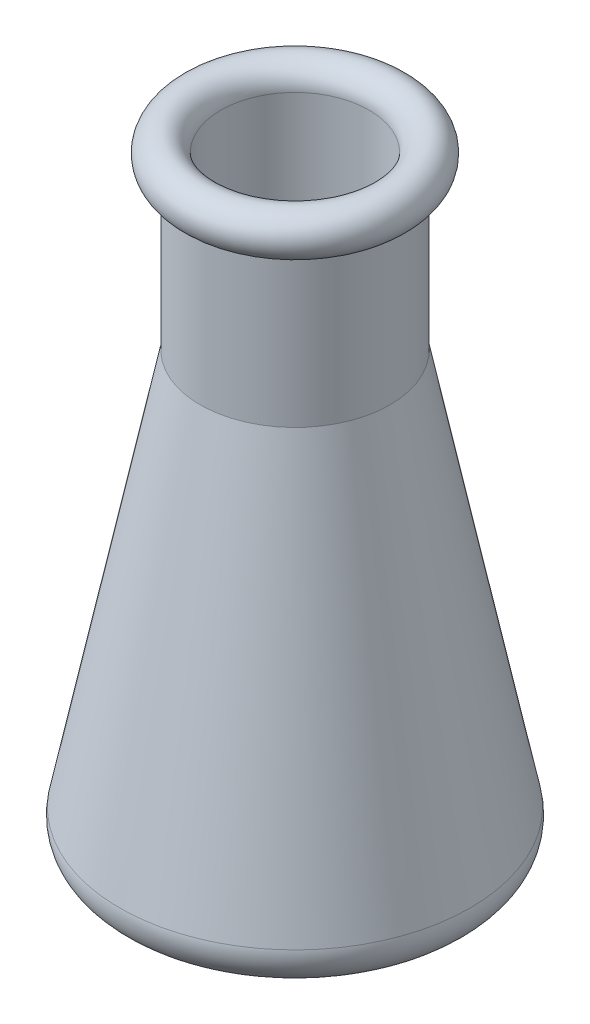
ISO-10303-21;
HEADER;
FILE_DESCRIPTION(('STEP AP214'),'2;1');
FILE_NAME('part.step','',(''),(''),'','','');
FILE_SCHEMA(('AUTOMOTIVE_DESIGN { 1 0 10303 214 1 1 1 1 }'));
ENDSEC;
DATA;
#1=APPLICATION_CONTEXT('core data for automotive mechanical design processes');
#2=APPLICATION_PROTOCOL_DEFINITION('international standard','automotive_design',2000,#1);
#3=PRODUCT_CONTEXT('',#1,'mechanical');
#4=PRODUCT('Part','Part','',(#3));
#5=PRODUCT_RELATED_PRODUCT_CATEGORY('part','',(#4));
#6=PRODUCT_DEFINITION_FORMATION('','',#4);
#7=PRODUCT_DEFINITION_CONTEXT('part definition',#1,'design');
#8=PRODUCT_DEFINITION('design','',#6,#7);
#9=PRODUCT_DEFINITION_SHAPE('','',#8);
#10=(LENGTH_UNIT() NAMED_UNIT(*) SI_UNIT(.MILLI.,.METRE.));
#11=(NAMED_UNIT(*) PLANE_ANGLE_UNIT() SI_UNIT($,.RADIAN.));
#12=(NAMED_UNIT(*) SI_UNIT($,.STERADIAN.) SOLID_ANGLE_UNIT());
#13=UNCERTAINTY_MEASURE_WITH_UNIT(LENGTH_MEASURE(1.E-05),#10,'distance_accuracy_value','');
#14=(GEOMETRIC_REPRESENTATION_CONTEXT(3) GLOBAL_UNCERTAINTY_ASSIGNED_CONTEXT((#13)) GLOBAL_UNIT_ASSIGNED_CONTEXT((#10,
#11,#12)) REPRESENTATION_CONTEXT('',''));
#15=CARTESIAN_POINT('',(0.,0.,0.));
#16=DIRECTION('',(0.,0.,1.));
#17=DIRECTION('',(1.,0.,0.));
#18=AXIS2_PLACEMENT_3D('',#15,#16,#17);
#19=CARTESIAN_POINT('',(0.,-2.18801274353124,0.));
#20=DIRECTION('',(0.,1.,0.));
#21=DIRECTION('',(-1.,0.,0.));
#22=AXIS2_PLACEMENT_3D('',#19,#20,#21);
#23=TOROIDAL_SURFACE('',#22,11.4,2.5);
#24=CARTESIAN_POINT('',(0.,-4.68801274353124,0.));
#25=DIRECTION('',(0.,1.,0.));
#26=DIRECTION('',(-1.,0.,0.));
#27=AXIS2_PLACEMENT_3D('',#24,#25,#26);
#28=CIRCLE('',#27,11.4);
#29=CARTESIAN_POINT('',(-11.4,-4.68801274353124,0.));
#30=VERTEX_POINT('',#29);
#31=EDGE_CURVE('E70',#30,#30,#28,.T.);
#32=ORIENTED_EDGE('',*,*,#31,.T.);
#33=EDGE_LOOP('',(#32));
#34=FACE_BOUND('',#33,.T.);
#35=CARTESIAN_POINT('',(0.,-2.18801274353124,0.));
#36=DIRECTION('',(0.,1.,0.));
#37=DIRECTION('',(-1.,0.,0.));
#38=AXIS2_PLACEMENT_3D('',#35,#36,#37);
#39=CIRCLE('',#38,8.9);
#40=CARTESIAN_POINT('',(-8.9,-2.18801274353124,0.));
#41=VERTEX_POINT('',#40);
#42=EDGE_CURVE('E55',#41,#41,#39,.T.);
#43=ORIENTED_EDGE('',*,*,#42,.F.);
#44=EDGE_LOOP('',(#43));
#45=FACE_BOUND('',#44,.T.);
#46=ADVANCED_FACE('F42',(#34,#45),#23,.T.);
#47=CARTESIAN_POINT('',(0.,-27.3800867088457,0.));
#48=DIRECTION('',(0.,1.,0.));
#49=DIRECTION('',(-1.,0.,0.));
#50=AXIS2_PLACEMENT_3D('',#47,#48,#49);
#51=CYLINDRICAL_SURFACE('',#50,8.9);
#52=CARTESIAN_POINT('',(0.,-27.3800867088457,0.));
#53=DIRECTION('',(0.,1.,0.));
#54=DIRECTION('',(-1.,0.,0.));
#55=AXIS2_PLACEMENT_3D('',#52,#53,#54);
#56=CIRCLE('',#55,8.9);
#57=CARTESIAN_POINT('',(-8.89999999999999,-27.3800867088457,0.));
#58=VERTEX_POINT('',#57);
#59=EDGE_CURVE('E60',#58,#58,#56,.T.);
#60=ORIENTED_EDGE('',*,*,#59,.F.);
#61=EDGE_LOOP('',(#60));
#62=FACE_BOUND('',#61,.T.);
#63=ORIENTED_EDGE('',*,*,#42,.T.);
#64=EDGE_LOOP('',(#63));
#65=FACE_BOUND('',#64,.T.);
#66=ADVANCED_FACE('F90',(#62,#65),#51,.F.);
#67=CARTESIAN_POINT('',(0.,-27.3800867088457,0.));
#68=DIRECTION('',(0.,-1.,0.));
#69=DIRECTION('',(1.,0.,0.));
#70=AXIS2_PLACEMENT_3D('',#67,#68,#69);
#71=PLANE('',#70);
#72=ORIENTED_EDGE('',*,*,#59,.T.);
#73=EDGE_LOOP('',(#72));
#74=FACE_BOUND('',#73,.T.);
#75=ADVANCED_FACE('F94',(#74),#71,.F.);
#76=CARTESIAN_POINT('',(0.,-75.,0.));
#77=DIRECTION('',(0.,1.,0.));
#78=DIRECTION('',(-1.,0.,0.));
#79=AXIS2_PLACEMENT_3D('',#76,#77,#78);
#80=PLANE('',#79);
#81=CARTESIAN_POINT('',(0.,-75.,0.));
#82=DIRECTION('',(0.,1.,0.));
#83=DIRECTION('',(-1.,0.,0.));
#84=AXIS2_PLACEMENT_3D('',#81,#82,#83);
#85=CIRCLE('',#84,17.1081861922489);
#86=CARTESIAN_POINT('',(-17.1081861922489,-75.,0.));
#87=VERTEX_POINT('',#86);
#88=EDGE_CURVE('E10',#87,#87,#85,.F.);
#89=ORIENTED_EDGE('',*,*,#88,.T.);
#90=EDGE_LOOP('',(#89));
#91=FACE_BOUND('',#90,.T.);
#92=ADVANCED_FACE('F87',(#91),#80,.F.);
#93=CARTESIAN_POINT('',(0.,-22.6880127435312,0.));
#94=DIRECTION('',(0.,-1.,0.));
#95=DIRECTION('',(1.,0.,0.));
#96=AXIS2_PLACEMENT_3D('',#93,#94,#95);
#97=CONICAL_SURFACE('',#96,11.4,0.199923526630445);
#98=CARTESIAN_POINT('',(0.,-70.2056224751175,0.));
#99=DIRECTION('',(0.,-1.,0.));
#100=DIRECTION('',(1.,0.,0.));
#101=AXIS2_PLACEMENT_3D('',#98,#99,#100);
#102=CIRCLE('',#101,21.0285132638032);
#103=CARTESIAN_POINT('',(21.0285132638032,-70.2056224751175,0.));
#104=VERTEX_POINT('',#103);
#105=EDGE_CURVE('E50',#104,#104,#102,.F.);
#106=ORIENTED_EDGE('',*,*,#105,.T.);
#107=EDGE_LOOP('',(#106));
#108=FACE_BOUND('',#107,.T.);
#109=CARTESIAN_POINT('',(0.,-22.6880127435312,0.));
#110=DIRECTION('',(0.,1.,0.));
#111=DIRECTION('',(-1.,0.,0.));
#112=AXIS2_PLACEMENT_3D('',#109,#110,#111);
#113=CIRCLE('',#112,11.4);
#114=CARTESIAN_POINT('',(-11.4,-22.6880127435312,0.));
#115=VERTEX_POINT('',#114);
#116=EDGE_CURVE('E66',#115,#115,#113,.T.);
#117=ORIENTED_EDGE('',*,*,#116,.F.);
#118=EDGE_LOOP('',(#117));
#119=FACE_BOUND('',#118,.T.);
#120=ADVANCED_FACE('F79',(#108,#119),#97,.T.);
#121=CARTESIAN_POINT('',(0.,-27.3800867088457,0.));
#122=DIRECTION('',(0.,1.,0.));
#123=DIRECTION('',(-1.,0.,0.));
#124=AXIS2_PLACEMENT_3D('',#121,#122,#123);
#125=CYLINDRICAL_SURFACE('',#124,11.4);
#126=ORIENTED_EDGE('',*,*,#116,.T.);
#127=EDGE_LOOP('',(#126));
#128=FACE_BOUND('',#127,.T.);
#129=ORIENTED_EDGE('',*,*,#31,.F.);
#130=EDGE_LOOP('',(#129));
#131=FACE_BOUND('',#130,.T.);
#132=ADVANCED_FACE('F77',(#128,#131),#125,.T.);
#133=CARTESIAN_POINT('',(0.,-71.,0.));
#134=DIRECTION('',(0.,1.,0.));
#135=DIRECTION('',(-1.,0.,0.));
#136=AXIS2_PLACEMENT_3D('',#133,#134,#135);
#137=TOROIDAL_SURFACE('',#136,17.1081861922489,4.);
#138=ORIENTED_EDGE('',*,*,#88,.F.);
#139=EDGE_LOOP('',(#138));
#140=FACE_BOUND('',#139,.T.);
#141=ORIENTED_EDGE('',*,*,#105,.F.);
#142=EDGE_LOOP('',(#141));
#143=FACE_BOUND('',#142,.T.);
#144=ADVANCED_FACE('F44',(#140,#143),#137,.T.);
#145=CLOSED_SHELL('',(#46,#66,#75,#92,#120,#132,#144));
#146=MANIFOLD_SOLID_BREP('B2',#145);
#147=ADVANCED_BREP_SHAPE_REPRESENTATION('',(#18,#146),#14);
#148=SHAPE_DEFINITION_REPRESENTATION(#9,#147);
ENDSEC;
END-ISO-10303-21;
